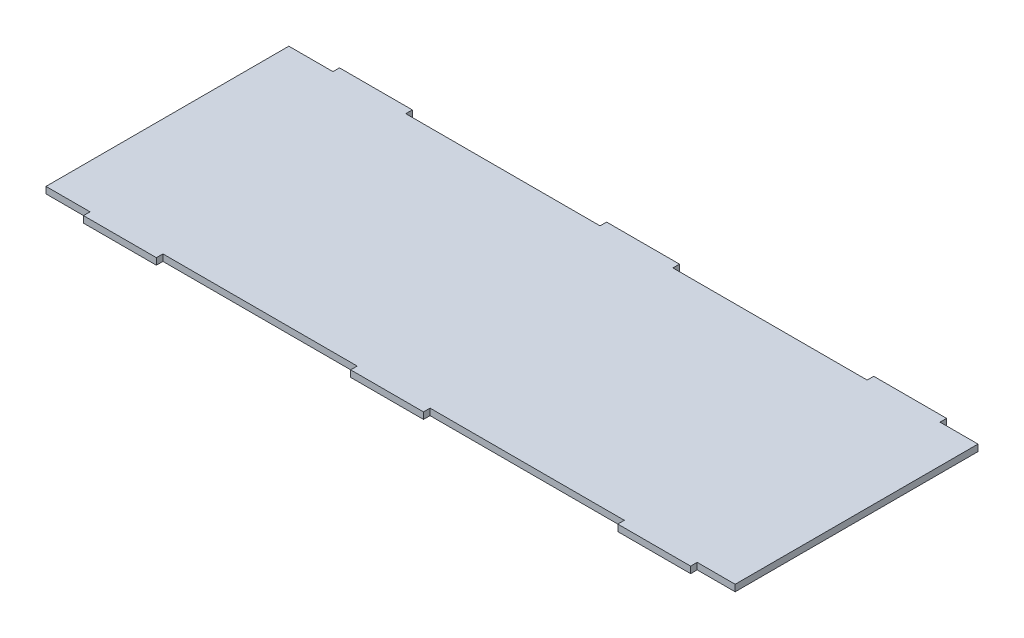
ISO-10303-21;
HEADER;
FILE_DESCRIPTION(('STEP AP214'),'2;1');
FILE_NAME('part.step','',(''),(''),'','','');
FILE_SCHEMA(('AUTOMOTIVE_DESIGN { 1 0 10303 214 1 1 1 1 }'));
ENDSEC;
DATA;
#1=APPLICATION_CONTEXT('core data for automotive mechanical design processes');
#2=APPLICATION_PROTOCOL_DEFINITION('international standard','automotive_design',2000,#1);
#3=PRODUCT_CONTEXT('',#1,'mechanical');
#4=PRODUCT('Part','Part','',(#3));
#5=PRODUCT_RELATED_PRODUCT_CATEGORY('part','',(#4));
#6=PRODUCT_DEFINITION_FORMATION('','',#4);
#7=PRODUCT_DEFINITION_CONTEXT('part definition',#1,'design');
#8=PRODUCT_DEFINITION('design','',#6,#7);
#9=PRODUCT_DEFINITION_SHAPE('','',#8);
#10=(LENGTH_UNIT() NAMED_UNIT(*) SI_UNIT(.MILLI.,.METRE.));
#11=(NAMED_UNIT(*) PLANE_ANGLE_UNIT() SI_UNIT($,.RADIAN.));
#12=(NAMED_UNIT(*) SI_UNIT($,.STERADIAN.) SOLID_ANGLE_UNIT());
#13=UNCERTAINTY_MEASURE_WITH_UNIT(LENGTH_MEASURE(1.E-05),#10,'distance_accuracy_value','');
#14=(GEOMETRIC_REPRESENTATION_CONTEXT(3) GLOBAL_UNCERTAINTY_ASSIGNED_CONTEXT((#13)) GLOBAL_UNIT_ASSIGNED_CONTEXT((#10,
#11,#12)) REPRESENTATION_CONTEXT('',''));
#15=CARTESIAN_POINT('',(0.,0.,0.));
#16=DIRECTION('',(0.,0.,1.));
#17=DIRECTION('',(1.,0.,0.));
#18=AXIS2_PLACEMENT_3D('',#15,#16,#17);
#19=CARTESIAN_POINT('',(0.,0.,0.));
#20=DIRECTION('',(0.,0.,-1.));
#21=DIRECTION('',(-1.,0.,0.));
#22=AXIS2_PLACEMENT_3D('',#19,#20,#21);
#23=PLANE('',#22);
#24=DIRECTION('',(1.,0.,0.));
#25=VECTOR('',#24,1.);
#26=CARTESIAN_POINT('',(-300.,2.7,0.));
#27=LINE('',#26,#25);
#28=CARTESIAN_POINT('',(-130.,2.7,7.68125894545489E-13));
#29=VERTEX_POINT('',#28);
#30=CARTESIAN_POINT('',(-50.,2.7,0.));
#31=VERTEX_POINT('',#30);
#32=EDGE_CURVE('E342',#29,#31,#27,.T.);
#33=ORIENTED_EDGE('',*,*,#32,.T.);
#34=DIRECTION('',(0.,1.,0.));
#35=VECTOR('',#34,1.);
#36=CARTESIAN_POINT('',(-50.,-30.1212549539359,0.));
#37=LINE('',#36,#35);
#38=CARTESIAN_POINT('',(-50.,0.,0.));
#39=VERTEX_POINT('',#38);
#40=EDGE_CURVE('E486',#39,#31,#37,.T.);
#41=ORIENTED_EDGE('',*,*,#40,.F.);
#42=DIRECTION('',(1.,0.,0.));
#43=VECTOR('',#42,1.);
#44=CARTESIAN_POINT('',(-300.,0.,0.));
#45=LINE('',#44,#43);
#46=CARTESIAN_POINT('',(-130.,0.,0.));
#47=VERTEX_POINT('',#46);
#48=EDGE_CURVE('E353',#47,#39,#45,.T.);
#49=ORIENTED_EDGE('',*,*,#48,.F.);
#50=DIRECTION('',(0.,1.,0.));
#51=VECTOR('',#50,1.);
#52=CARTESIAN_POINT('',(-130.,-30.1212549539359,7.68125894545489E-13));
#53=LINE('',#52,#51);
#54=EDGE_CURVE('E374',#47,#29,#53,.T.);
#55=ORIENTED_EDGE('',*,*,#54,.T.);
#56=EDGE_LOOP('',(#33,#41,#49,#55));
#57=FACE_BOUND('',#56,.T.);
#58=ADVANCED_FACE('F38',(#57),#23,.T.);
#59=CARTESIAN_POINT('',(-240.,2.7,0.));
#60=VERTEX_POINT('',#59);
#61=CARTESIAN_POINT('',(-160.,2.7,0.));
#62=VERTEX_POINT('',#61);
#63=EDGE_CURVE('E346',#60,#62,#27,.T.);
#64=ORIENTED_EDGE('',*,*,#63,.T.);
#65=DIRECTION('',(0.,1.,0.));
#66=VECTOR('',#65,1.);
#67=CARTESIAN_POINT('',(-160.,-30.1212549539359,7.68125894545489E-13));
#68=LINE('',#67,#66);
#69=CARTESIAN_POINT('',(-160.,0.,0.));
#70=VERTEX_POINT('',#69);
#71=EDGE_CURVE('E358',#70,#62,#68,.T.);
#72=ORIENTED_EDGE('',*,*,#71,.F.);
#73=CARTESIAN_POINT('',(-240.,0.,0.));
#74=VERTEX_POINT('',#73);
#75=EDGE_CURVE('E416',#74,#70,#45,.T.);
#76=ORIENTED_EDGE('',*,*,#75,.F.);
#77=DIRECTION('',(0.,1.,0.));
#78=VECTOR('',#77,1.);
#79=CARTESIAN_POINT('',(-240.,-30.1212549539359,1.53625178909098E-12));
#80=LINE('',#79,#78);
#81=EDGE_CURVE('E361',#74,#60,#80,.T.);
#82=ORIENTED_EDGE('',*,*,#81,.T.);
#83=EDGE_LOOP('',(#64,#72,#76,#82));
#84=FACE_BOUND('',#83,.T.);
#85=ADVANCED_FACE('F357',(#84),#23,.T.);
#86=DIRECTION('',(0.,1.,0.));
#87=VECTOR('',#86,1.);
#88=CARTESIAN_POINT('',(-4.36142359630139,0.,0.));
#89=LINE('',#88,#87);
#90=CARTESIAN_POINT('',(-4.36142359630139,0.,0.));
#91=VERTEX_POINT('',#90);
#92=CARTESIAN_POINT('',(-4.36142359630143,2.7,0.));
#93=VERTEX_POINT('',#92);
#94=EDGE_CURVE('E53',#91,#93,#89,.T.);
#95=ORIENTED_EDGE('',*,*,#94,.F.);
#96=CARTESIAN_POINT('',(-20.,0.,0.));
#97=VERTEX_POINT('',#96);
#98=EDGE_CURVE('E235',#97,#91,#45,.T.);
#99=ORIENTED_EDGE('',*,*,#98,.F.);
#100=DIRECTION('',(0.,1.,0.));
#101=VECTOR('',#100,1.);
#102=CARTESIAN_POINT('',(-20.,-30.1212549539359,0.));
#103=LINE('',#102,#101);
#104=CARTESIAN_POINT('',(-20.,2.7,0.));
#105=VERTEX_POINT('',#104);
#106=EDGE_CURVE('E484',#97,#105,#103,.T.);
#107=ORIENTED_EDGE('',*,*,#106,.T.);
#108=EDGE_CURVE('E339',#105,#93,#27,.T.);
#109=ORIENTED_EDGE('',*,*,#108,.T.);
#110=EDGE_LOOP('',(#95,#99,#107,#109));
#111=FACE_BOUND('',#110,.T.);
#112=ADVANCED_FACE('F461',(#111),#23,.T.);
#113=CARTESIAN_POINT('',(0.,0.,100.));
#114=DIRECTION('',(0.,0.,-1.));
#115=DIRECTION('',(1.,0.,0.));
#116=AXIS2_PLACEMENT_3D('',#113,#114,#115);
#117=PLANE('',#116);
#118=DIRECTION('',(0.,1.,0.));
#119=VECTOR('',#118,1.);
#120=CARTESIAN_POINT('',(-240.,-30.1212549539359,99.9999999999984));
#121=LINE('',#120,#119);
#122=CARTESIAN_POINT('',(-240.,0.,99.9999999999984));
#123=VERTEX_POINT('',#122);
#124=CARTESIAN_POINT('',(-240.,2.7,99.9999999999984));
#125=VERTEX_POINT('',#124);
#126=EDGE_CURVE('E267',#123,#125,#121,.T.);
#127=ORIENTED_EDGE('',*,*,#126,.F.);
#128=DIRECTION('',(-1.,0.,0.));
#129=VECTOR('',#128,1.);
#130=CARTESIAN_POINT('',(-300.,0.,100.));
#131=LINE('',#130,#129);
#132=CARTESIAN_POINT('',(-160.,0.,100.000000000001));
#133=VERTEX_POINT('',#132);
#134=EDGE_CURVE('E245',#133,#123,#131,.T.);
#135=ORIENTED_EDGE('',*,*,#134,.F.);
#136=DIRECTION('',(0.,1.,0.));
#137=VECTOR('',#136,1.);
#138=CARTESIAN_POINT('',(-160.,-30.1212549539359,100.000000000001));
#139=LINE('',#138,#137);
#140=CARTESIAN_POINT('',(-160.,2.7,100.));
#141=VERTEX_POINT('',#140);
#142=EDGE_CURVE('E265',#133,#141,#139,.T.);
#143=ORIENTED_EDGE('',*,*,#142,.T.);
#144=DIRECTION('',(-1.,0.,0.));
#145=VECTOR('',#144,1.);
#146=CARTESIAN_POINT('',(-300.,2.7,100.));
#147=LINE('',#146,#145);
#148=EDGE_CURVE('E247',#141,#125,#147,.T.);
#149=ORIENTED_EDGE('',*,*,#148,.T.);
#150=EDGE_LOOP('',(#127,#135,#143,#149));
#151=FACE_BOUND('',#150,.T.);
#152=ADVANCED_FACE('F263',(#151),#117,.F.);
#153=CARTESIAN_POINT('',(-4.36142359630138,0.,100.));
#154=VERTEX_POINT('',#153);
#155=CARTESIAN_POINT('',(-20.,0.,100.));
#156=VERTEX_POINT('',#155);
#157=EDGE_CURVE('E232',#154,#156,#131,.T.);
#158=ORIENTED_EDGE('',*,*,#157,.F.);
#159=DIRECTION('',(0.,1.,0.));
#160=VECTOR('',#159,1.);
#161=CARTESIAN_POINT('',(-4.36142359630138,0.,100.));
#162=LINE('',#161,#160);
#163=CARTESIAN_POINT('',(-4.36142359630138,2.7,100.));
#164=VERTEX_POINT('',#163);
#165=EDGE_CURVE('E220',#154,#164,#162,.T.);
#166=ORIENTED_EDGE('',*,*,#165,.T.);
#167=CARTESIAN_POINT('',(-20.,2.7,100.));
#168=VERTEX_POINT('',#167);
#169=EDGE_CURVE('E46',#164,#168,#147,.T.);
#170=ORIENTED_EDGE('',*,*,#169,.T.);
#171=DIRECTION('',(0.,1.,0.));
#172=VECTOR('',#171,1.);
#173=CARTESIAN_POINT('',(-20.,-30.1212549539359,99.9999999999999));
#174=LINE('',#173,#172);
#175=EDGE_CURVE('E239',#156,#168,#174,.T.);
#176=ORIENTED_EDGE('',*,*,#175,.F.);
#177=EDGE_LOOP('',(#158,#166,#170,#176));
#178=FACE_BOUND('',#177,.T.);
#179=ADVANCED_FACE('F237',(#178),#117,.F.);
#180=CARTESIAN_POINT('',(-50.,0.,100.));
#181=VERTEX_POINT('',#180);
#182=CARTESIAN_POINT('',(-130.,0.,99.9999999999992));
#183=VERTEX_POINT('',#182);
#184=EDGE_CURVE('E242',#181,#183,#131,.T.);
#185=ORIENTED_EDGE('',*,*,#184,.F.);
#186=DIRECTION('',(0.,1.,0.));
#187=VECTOR('',#186,1.);
#188=CARTESIAN_POINT('',(-50.,-30.1212549539359,100.000000000001));
#189=LINE('',#188,#187);
#190=CARTESIAN_POINT('',(-50.,2.7,100.000000000001));
#191=VERTEX_POINT('',#190);
#192=EDGE_CURVE('E304',#181,#191,#189,.T.);
#193=ORIENTED_EDGE('',*,*,#192,.T.);
#194=CARTESIAN_POINT('',(-130.,2.7,99.9999999999992));
#195=VERTEX_POINT('',#194);
#196=EDGE_CURVE('E248',#191,#195,#147,.T.);
#197=ORIENTED_EDGE('',*,*,#196,.T.);
#198=DIRECTION('',(0.,1.,0.));
#199=VECTOR('',#198,1.);
#200=CARTESIAN_POINT('',(-130.,-30.1212549539359,99.9999999999992));
#201=LINE('',#200,#199);
#202=EDGE_CURVE('E334',#183,#195,#201,.T.);
#203=ORIENTED_EDGE('',*,*,#202,.F.);
#204=EDGE_LOOP('',(#185,#193,#197,#203));
#205=FACE_BOUND('',#204,.T.);
#206=ADVANCED_FACE('F431',(#205),#117,.F.);
#207=CARTESIAN_POINT('',(-300.,0.,400.012149753972));
#208=DIRECTION('',(0.,1.,0.));
#209=DIRECTION('',(0.,0.,1.));
#210=AXIS2_PLACEMENT_3D('',#207,#208,#209);
#211=PLANE('',#210);
#212=ORIENTED_EDGE('',*,*,#98,.T.);
#213=DIRECTION('',(0.,0.,1.));
#214=VECTOR('',#213,1.);
#215=CARTESIAN_POINT('',(-4.36142359630139,0.,0.));
#216=LINE('',#215,#214);
#217=EDGE_CURVE('E223',#91,#154,#216,.T.);
#218=ORIENTED_EDGE('',*,*,#217,.T.);
#219=ORIENTED_EDGE('',*,*,#157,.T.);
#220=DIRECTION('',(0.,0.,-1.));
#221=VECTOR('',#220,1.);
#222=CARTESIAN_POINT('',(-20.,0.,99.9999999999999));
#223=LINE('',#222,#221);
#224=CARTESIAN_POINT('',(-20.,0.,102.700000000001));
#225=VERTEX_POINT('',#224);
#226=EDGE_CURVE('E297',#225,#156,#223,.T.);
#227=ORIENTED_EDGE('',*,*,#226,.F.);
#228=DIRECTION('',(-1.,0.,0.));
#229=VECTOR('',#228,1.);
#230=CARTESIAN_POINT('',(-50.,0.,102.700000000001));
#231=LINE('',#230,#229);
#232=CARTESIAN_POINT('',(-50.,0.,102.700000000001));
#233=VERTEX_POINT('',#232);
#234=EDGE_CURVE('E300',#225,#233,#231,.T.);
#235=ORIENTED_EDGE('',*,*,#234,.T.);
#236=DIRECTION('',(0.,0.,-1.));
#237=VECTOR('',#236,1.);
#238=CARTESIAN_POINT('',(-50.,0.,100.000000000001));
#239=LINE('',#238,#237);
#240=EDGE_CURVE('E293',#233,#181,#239,.T.);
#241=ORIENTED_EDGE('',*,*,#240,.T.);
#242=ORIENTED_EDGE('',*,*,#184,.T.);
#243=DIRECTION('',(0.,0.,-1.));
#244=VECTOR('',#243,1.);
#245=CARTESIAN_POINT('',(-130.,0.,99.9999999999992));
#246=LINE('',#245,#244);
#247=CARTESIAN_POINT('',(-130.,0.,102.700000000001));
#248=VERTEX_POINT('',#247);
#249=EDGE_CURVE('E319',#248,#183,#246,.T.);
#250=ORIENTED_EDGE('',*,*,#249,.F.);
#251=DIRECTION('',(-1.,0.,0.));
#252=VECTOR('',#251,1.);
#253=CARTESIAN_POINT('',(-160.,0.,102.700000000001));
#254=LINE('',#253,#252);
#255=CARTESIAN_POINT('',(-160.,0.,102.700000000001));
#256=VERTEX_POINT('',#255);
#257=EDGE_CURVE('E323',#248,#256,#254,.T.);
#258=ORIENTED_EDGE('',*,*,#257,.T.);
#259=DIRECTION('',(0.,0.,-1.));
#260=VECTOR('',#259,1.);
#261=CARTESIAN_POINT('',(-160.,0.,100.000000000001));
#262=LINE('',#261,#260);
#263=EDGE_CURVE('E258',#256,#133,#262,.T.);
#264=ORIENTED_EDGE('',*,*,#263,.T.);
#265=ORIENTED_EDGE('',*,*,#134,.T.);
#266=DIRECTION('',(0.,0.,-1.));
#267=VECTOR('',#266,1.);
#268=CARTESIAN_POINT('',(-240.,0.,99.9999999999984));
#269=LINE('',#268,#267);
#270=CARTESIAN_POINT('',(-240.,0.,102.7));
#271=VERTEX_POINT('',#270);
#272=EDGE_CURVE('E255',#271,#123,#269,.T.);
#273=ORIENTED_EDGE('',*,*,#272,.F.);
#274=DIRECTION('',(-1.,0.,0.));
#275=VECTOR('',#274,1.);
#276=CARTESIAN_POINT('',(-270.,0.,102.7));
#277=LINE('',#276,#275);
#278=CARTESIAN_POINT('',(-270.,0.,102.7));
#279=VERTEX_POINT('',#278);
#280=EDGE_CURVE('E272',#271,#279,#277,.T.);
#281=ORIENTED_EDGE('',*,*,#280,.T.);
#282=DIRECTION('',(0.,0.,-1.));
#283=VECTOR('',#282,1.);
#284=CARTESIAN_POINT('',(-270.,0.,100.));
#285=LINE('',#284,#283);
#286=CARTESIAN_POINT('',(-270.,0.,100.));
#287=VERTEX_POINT('',#286);
#288=EDGE_CURVE('E278',#279,#287,#285,.T.);
#289=ORIENTED_EDGE('',*,*,#288,.T.);
#290=CARTESIAN_POINT('',(-288.150181397969,0.,100.));
#291=VERTEX_POINT('',#290);
#292=EDGE_CURVE('E244',#287,#291,#131,.T.);
#293=ORIENTED_EDGE('',*,*,#292,.T.);
#294=DIRECTION('',(0.,0.,-1.));
#295=VECTOR('',#294,1.);
#296=CARTESIAN_POINT('',(-288.150181397969,0.,102.700000000001));
#297=LINE('',#296,#295);
#298=CARTESIAN_POINT('',(-288.150181397969,0.,0.));
#299=VERTEX_POINT('',#298);
#300=EDGE_CURVE('E61',#291,#299,#297,.T.);
#301=ORIENTED_EDGE('',*,*,#300,.T.);
#302=CARTESIAN_POINT('',(-270.,0.,0.));
#303=VERTEX_POINT('',#302);
#304=EDGE_CURVE('E252',#299,#303,#45,.T.);
#305=ORIENTED_EDGE('',*,*,#304,.T.);
#306=DIRECTION('',(0.,0.,1.));
#307=VECTOR('',#306,1.);
#308=CARTESIAN_POINT('',(-270.,0.,1.53625178909098E-12));
#309=LINE('',#308,#307);
#310=CARTESIAN_POINT('',(-270.,0.,-2.7));
#311=VERTEX_POINT('',#310);
#312=EDGE_CURVE('E380',#311,#303,#309,.T.);
#313=ORIENTED_EDGE('',*,*,#312,.F.);
#314=DIRECTION('',(-1.,0.,0.));
#315=VECTOR('',#314,1.);
#316=CARTESIAN_POINT('',(-270.,0.,-2.7));
#317=LINE('',#316,#315);
#318=CARTESIAN_POINT('',(-240.,0.,-2.7));
#319=VERTEX_POINT('',#318);
#320=EDGE_CURVE('E383',#319,#311,#317,.T.);
#321=ORIENTED_EDGE('',*,*,#320,.F.);
#322=DIRECTION('',(0.,0.,1.));
#323=VECTOR('',#322,1.);
#324=CARTESIAN_POINT('',(-240.,0.,1.53625178909098E-12));
#325=LINE('',#324,#323);
#326=EDGE_CURVE('E400',#319,#74,#325,.T.);
#327=ORIENTED_EDGE('',*,*,#326,.T.);
#328=ORIENTED_EDGE('',*,*,#75,.T.);
#329=DIRECTION('',(0.,0.,1.));
#330=VECTOR('',#329,1.);
#331=CARTESIAN_POINT('',(-160.,0.,7.68125894545489E-13));
#332=LINE('',#331,#330);
#333=CARTESIAN_POINT('',(-160.,0.,-2.70000000000077));
#334=VERTEX_POINT('',#333);
#335=EDGE_CURVE('E372',#334,#70,#332,.T.);
#336=ORIENTED_EDGE('',*,*,#335,.F.);
#337=DIRECTION('',(-1.,0.,0.));
#338=VECTOR('',#337,1.);
#339=CARTESIAN_POINT('',(-160.,0.,-2.70000000000077));
#340=LINE('',#339,#338);
#341=CARTESIAN_POINT('',(-130.,0.,-2.70000000000077));
#342=VERTEX_POINT('',#341);
#343=EDGE_CURVE('E389',#342,#334,#340,.T.);
#344=ORIENTED_EDGE('',*,*,#343,.F.);
#345=DIRECTION('',(0.,0.,1.));
#346=VECTOR('',#345,1.);
#347=CARTESIAN_POINT('',(-130.,0.,7.68125894545489E-13));
#348=LINE('',#347,#346);
#349=EDGE_CURVE('E393',#342,#47,#348,.T.);
#350=ORIENTED_EDGE('',*,*,#349,.T.);
#351=ORIENTED_EDGE('',*,*,#48,.T.);
#352=DIRECTION('',(0.,0.,1.));
#353=VECTOR('',#352,1.);
#354=CARTESIAN_POINT('',(-50.,0.,0.));
#355=LINE('',#354,#353);
#356=CARTESIAN_POINT('',(-50.,0.,-2.70000000000154));
#357=VERTEX_POINT('',#356);
#358=EDGE_CURVE('E478',#357,#39,#355,.T.);
#359=ORIENTED_EDGE('',*,*,#358,.F.);
#360=DIRECTION('',(-1.,0.,0.));
#361=VECTOR('',#360,1.);
#362=CARTESIAN_POINT('',(-50.,0.,-2.70000000000154));
#363=LINE('',#362,#361);
#364=CARTESIAN_POINT('',(-20.,0.,-2.70000000000154));
#365=VERTEX_POINT('',#364);
#366=EDGE_CURVE('E476',#365,#357,#363,.T.);
#367=ORIENTED_EDGE('',*,*,#366,.F.);
#368=DIRECTION('',(0.,0.,1.));
#369=VECTOR('',#368,1.);
#370=CARTESIAN_POINT('',(-20.,0.,0.));
#371=LINE('',#370,#369);
#372=EDGE_CURVE('E482',#365,#97,#371,.T.);
#373=ORIENTED_EDGE('',*,*,#372,.T.);
#374=EDGE_LOOP('',(#212,#218,#219,#227,#235,#241,#242,#250,#258,#264,#265,#273,#281,#289,#293,
#301,#305,#313,#321,#327,#328,#336,#344,#350,#351,#359,#367,#373));
#375=FACE_BOUND('',#374,.T.);
#376=ADVANCED_FACE('F231',(#375),#211,.F.);
#377=CARTESIAN_POINT('',(-300.,2.7,400.012149753972));
#378=DIRECTION('',(0.,1.,0.));
#379=DIRECTION('',(-1.,0.,0.));
#380=AXIS2_PLACEMENT_3D('',#377,#378,#379);
#381=PLANE('',#380);
#382=DIRECTION('',(0.,0.,1.));
#383=VECTOR('',#382,1.);
#384=CARTESIAN_POINT('',(-4.36142359630139,2.7,0.));
#385=LINE('',#384,#383);
#386=EDGE_CURVE('E224',#93,#164,#385,.T.);
#387=ORIENTED_EDGE('',*,*,#386,.F.);
#388=ORIENTED_EDGE('',*,*,#108,.F.);
#389=DIRECTION('',(0.,0.,-1.));
#390=VECTOR('',#389,1.);
#391=CARTESIAN_POINT('',(-20.,2.7,0.));
#392=LINE('',#391,#390);
#393=CARTESIAN_POINT('',(-20.,2.7,-2.70000000000154));
#394=VERTEX_POINT('',#393);
#395=EDGE_CURVE('E494',#105,#394,#392,.T.);
#396=ORIENTED_EDGE('',*,*,#395,.T.);
#397=DIRECTION('',(1.,0.,0.));
#398=VECTOR('',#397,1.);
#399=CARTESIAN_POINT('',(-50.,2.7,-2.70000000000154));
#400=LINE('',#399,#398);
#401=CARTESIAN_POINT('',(-50.,2.7,-2.70000000000154));
#402=VERTEX_POINT('',#401);
#403=EDGE_CURVE('E390',#402,#394,#400,.T.);
#404=ORIENTED_EDGE('',*,*,#403,.F.);
#405=DIRECTION('',(0.,0.,-1.));
#406=VECTOR('',#405,1.);
#407=CARTESIAN_POINT('',(-50.,2.7,0.));
#408=LINE('',#407,#406);
#409=EDGE_CURVE('E491',#31,#402,#408,.T.);
#410=ORIENTED_EDGE('',*,*,#409,.F.);
#411=ORIENTED_EDGE('',*,*,#32,.F.);
#412=DIRECTION('',(0.,0.,-1.));
#413=VECTOR('',#412,1.);
#414=CARTESIAN_POINT('',(-130.,2.7,7.68125894545489E-13));
#415=LINE('',#414,#413);
#416=CARTESIAN_POINT('',(-130.,2.7,-2.70000000000077));
#417=VERTEX_POINT('',#416);
#418=EDGE_CURVE('E373',#29,#417,#415,.T.);
#419=ORIENTED_EDGE('',*,*,#418,.T.);
#420=DIRECTION('',(1.,0.,0.));
#421=VECTOR('',#420,1.);
#422=CARTESIAN_POINT('',(-160.,2.7,-2.70000000000077));
#423=LINE('',#422,#421);
#424=CARTESIAN_POINT('',(-160.,2.7,-2.70000000000077));
#425=VERTEX_POINT('',#424);
#426=EDGE_CURVE('E379',#425,#417,#423,.T.);
#427=ORIENTED_EDGE('',*,*,#426,.F.);
#428=DIRECTION('',(0.,0.,-1.));
#429=VECTOR('',#428,1.);
#430=CARTESIAN_POINT('',(-160.,2.7,7.68125894545489E-13));
#431=LINE('',#430,#429);
#432=EDGE_CURVE('E371',#62,#425,#431,.T.);
#433=ORIENTED_EDGE('',*,*,#432,.F.);
#434=ORIENTED_EDGE('',*,*,#63,.F.);
#435=DIRECTION('',(0.,0.,-1.));
#436=VECTOR('',#435,1.);
#437=CARTESIAN_POINT('',(-240.,2.7,1.53625178909098E-12));
#438=LINE('',#437,#436);
#439=CARTESIAN_POINT('',(-240.,2.7,-2.7));
#440=VERTEX_POINT('',#439);
#441=EDGE_CURVE('E405',#60,#440,#438,.T.);
#442=ORIENTED_EDGE('',*,*,#441,.T.);
#443=DIRECTION('',(1.,0.,0.));
#444=VECTOR('',#443,1.);
#445=CARTESIAN_POINT('',(-270.,2.7,-2.7));
#446=LINE('',#445,#444);
#447=CARTESIAN_POINT('',(-270.,2.7,-2.7));
#448=VERTEX_POINT('',#447);
#449=EDGE_CURVE('E407',#448,#440,#446,.T.);
#450=ORIENTED_EDGE('',*,*,#449,.F.);
#451=DIRECTION('',(0.,0.,-1.));
#452=VECTOR('',#451,1.);
#453=CARTESIAN_POINT('',(-270.,2.7,1.53625178909098E-12));
#454=LINE('',#453,#452);
#455=CARTESIAN_POINT('',(-270.,2.7,1.53625178909098E-12));
#456=VERTEX_POINT('',#455);
#457=EDGE_CURVE('E410',#456,#448,#454,.T.);
#458=ORIENTED_EDGE('',*,*,#457,.F.);
#459=CARTESIAN_POINT('',(-288.150181397969,2.7,0.));
#460=VERTEX_POINT('',#459);
#461=EDGE_CURVE('E343',#460,#456,#27,.T.);
#462=ORIENTED_EDGE('',*,*,#461,.F.);
#463=DIRECTION('',(0.,0.,-1.));
#464=VECTOR('',#463,1.);
#465=CARTESIAN_POINT('',(-288.150181397969,2.7,102.700000000001));
#466=LINE('',#465,#464);
#467=CARTESIAN_POINT('',(-288.150181397969,2.7,100.));
#468=VERTEX_POINT('',#467);
#469=EDGE_CURVE('E471',#468,#460,#466,.T.);
#470=ORIENTED_EDGE('',*,*,#469,.F.);
#471=CARTESIAN_POINT('',(-270.,2.7,100.));
#472=VERTEX_POINT('',#471);
#473=EDGE_CURVE('E241',#472,#468,#147,.T.);
#474=ORIENTED_EDGE('',*,*,#473,.F.);
#475=DIRECTION('',(0.,0.,1.));
#476=VECTOR('',#475,1.);
#477=CARTESIAN_POINT('',(-270.,2.7,100.));
#478=LINE('',#477,#476);
#479=CARTESIAN_POINT('',(-270.,2.7,102.7));
#480=VERTEX_POINT('',#479);
#481=EDGE_CURVE('E285',#472,#480,#478,.T.);
#482=ORIENTED_EDGE('',*,*,#481,.T.);
#483=DIRECTION('',(1.,0.,0.));
#484=VECTOR('',#483,1.);
#485=CARTESIAN_POINT('',(-270.,2.7,102.7));
#486=LINE('',#485,#484);
#487=CARTESIAN_POINT('',(-240.,2.7,102.7));
#488=VERTEX_POINT('',#487);
#489=EDGE_CURVE('E288',#480,#488,#486,.T.);
#490=ORIENTED_EDGE('',*,*,#489,.T.);
#491=DIRECTION('',(0.,0.,1.));
#492=VECTOR('',#491,1.);
#493=CARTESIAN_POINT('',(-240.,2.7,99.9999999999984));
#494=LINE('',#493,#492);
#495=EDGE_CURVE('E291',#125,#488,#494,.T.);
#496=ORIENTED_EDGE('',*,*,#495,.F.);
#497=ORIENTED_EDGE('',*,*,#148,.F.);
#498=DIRECTION('',(0.,0.,1.));
#499=VECTOR('',#498,1.);
#500=CARTESIAN_POINT('',(-160.,2.7,100.000000000001));
#501=LINE('',#500,#499);
#502=CARTESIAN_POINT('',(-160.,2.7,102.700000000001));
#503=VERTEX_POINT('',#502);
#504=EDGE_CURVE('E316',#141,#503,#501,.T.);
#505=ORIENTED_EDGE('',*,*,#504,.T.);
#506=DIRECTION('',(1.,0.,0.));
#507=VECTOR('',#506,1.);
#508=CARTESIAN_POINT('',(-160.,2.7,102.700000000001));
#509=LINE('',#508,#507);
#510=CARTESIAN_POINT('',(-130.,2.7,102.700000000001));
#511=VERTEX_POINT('',#510);
#512=EDGE_CURVE('E326',#503,#511,#509,.T.);
#513=ORIENTED_EDGE('',*,*,#512,.T.);
#514=DIRECTION('',(0.,0.,1.));
#515=VECTOR('',#514,1.);
#516=CARTESIAN_POINT('',(-130.,2.7,99.9999999999992));
#517=LINE('',#516,#515);
#518=EDGE_CURVE('E329',#195,#511,#517,.T.);
#519=ORIENTED_EDGE('',*,*,#518,.F.);
#520=ORIENTED_EDGE('',*,*,#196,.F.);
#521=DIRECTION('',(0.,0.,1.));
#522=VECTOR('',#521,1.);
#523=CARTESIAN_POINT('',(-50.,2.7,100.000000000001));
#524=LINE('',#523,#522);
#525=CARTESIAN_POINT('',(-50.,2.7,102.700000000001));
#526=VERTEX_POINT('',#525);
#527=EDGE_CURVE('E307',#191,#526,#524,.T.);
#528=ORIENTED_EDGE('',*,*,#527,.T.);
#529=DIRECTION('',(1.,0.,0.));
#530=VECTOR('',#529,1.);
#531=CARTESIAN_POINT('',(-50.,2.7,102.700000000001));
#532=LINE('',#531,#530);
#533=CARTESIAN_POINT('',(-20.,2.7,102.700000000001));
#534=VERTEX_POINT('',#533);
#535=EDGE_CURVE('E310',#526,#534,#532,.T.);
#536=ORIENTED_EDGE('',*,*,#535,.T.);
#537=DIRECTION('',(0.,0.,1.));
#538=VECTOR('',#537,1.);
#539=CARTESIAN_POINT('',(-20.,2.7,99.9999999999999));
#540=LINE('',#539,#538);
#541=EDGE_CURVE('E313',#168,#534,#540,.T.);
#542=ORIENTED_EDGE('',*,*,#541,.F.);
#543=ORIENTED_EDGE('',*,*,#169,.F.);
#544=EDGE_LOOP('',(#387,#388,#396,#404,#410,#411,#419,#427,#433,#434,#442,#450,#458,#462,#470,
#474,#482,#490,#496,#497,#505,#513,#519,#520,#528,#536,#542,#543));
#545=FACE_BOUND('',#544,.T.);
#546=ADVANCED_FACE('F40',(#545),#381,.T.);
#547=DIRECTION('',(0.,-1.,0.));
#548=VECTOR('',#547,1.);
#549=CARTESIAN_POINT('',(-288.150181397969,2.7,0.));
#550=LINE('',#549,#548);
#551=EDGE_CURVE('E428',#460,#299,#550,.T.);
#552=ORIENTED_EDGE('',*,*,#551,.F.);
#553=ORIENTED_EDGE('',*,*,#461,.T.);
#554=DIRECTION('',(0.,1.,0.));
#555=VECTOR('',#554,1.);
#556=CARTESIAN_POINT('',(-270.,-30.1212549539359,1.53625178909098E-12));
#557=LINE('',#556,#555);
#558=EDGE_CURVE('E403',#303,#456,#557,.T.);
#559=ORIENTED_EDGE('',*,*,#558,.F.);
#560=ORIENTED_EDGE('',*,*,#304,.F.);
#561=EDGE_LOOP('',(#552,#553,#559,#560));
#562=FACE_BOUND('',#561,.T.);
#563=ADVANCED_FACE('F427',(#562),#23,.T.);
#564=ORIENTED_EDGE('',*,*,#473,.T.);
#565=DIRECTION('',(0.,-1.,0.));
#566=VECTOR('',#565,1.);
#567=CARTESIAN_POINT('',(-288.150181397969,0.,100.));
#568=LINE('',#567,#566);
#569=EDGE_CURVE('E11',#468,#291,#568,.T.);
#570=ORIENTED_EDGE('',*,*,#569,.T.);
#571=ORIENTED_EDGE('',*,*,#292,.F.);
#572=DIRECTION('',(0.,1.,0.));
#573=VECTOR('',#572,1.);
#574=CARTESIAN_POINT('',(-270.,-30.1212549539359,100.));
#575=LINE('',#574,#573);
#576=EDGE_CURVE('E282',#287,#472,#575,.T.);
#577=ORIENTED_EDGE('',*,*,#576,.T.);
#578=EDGE_LOOP('',(#564,#570,#571,#577));
#579=FACE_BOUND('',#578,.T.);
#580=ADVANCED_FACE('F445',(#579),#117,.F.);
#581=CARTESIAN_POINT('',(-160.,-30.1212549539359,100.000000000001));
#582=DIRECTION('',(-1.,0.,0.));
#583=DIRECTION('',(0.,-1.,0.));
#584=AXIS2_PLACEMENT_3D('',#581,#582,#583);
#585=PLANE('',#584);
#586=ORIENTED_EDGE('',*,*,#263,.F.);
#587=DIRECTION('',(0.,1.,0.));
#588=VECTOR('',#587,1.);
#589=CARTESIAN_POINT('',(-160.,-30.1212549539359,102.700000000001));
#590=LINE('',#589,#588);
#591=EDGE_CURVE('E332',#256,#503,#590,.T.);
#592=ORIENTED_EDGE('',*,*,#591,.T.);
#593=ORIENTED_EDGE('',*,*,#504,.F.);
#594=ORIENTED_EDGE('',*,*,#142,.F.);
#595=EDGE_LOOP('',(#586,#592,#593,#594));
#596=FACE_BOUND('',#595,.T.);
#597=ADVANCED_FACE('F443',(#596),#585,.T.);
#598=CARTESIAN_POINT('',(-130.,-30.1212549539359,99.9999999999992));
#599=DIRECTION('',(-1.,0.,0.));
#600=DIRECTION('',(0.,-1.,0.));
#601=AXIS2_PLACEMENT_3D('',#598,#599,#600);
#602=PLANE('',#601);
#603=DIRECTION('',(0.,1.,0.));
#604=VECTOR('',#603,1.);
#605=CARTESIAN_POINT('',(-130.,-30.1212549539359,102.700000000001));
#606=LINE('',#605,#604);
#607=EDGE_CURVE('E337',#248,#511,#606,.T.);
#608=ORIENTED_EDGE('',*,*,#607,.F.);
#609=ORIENTED_EDGE('',*,*,#249,.T.);
#610=ORIENTED_EDGE('',*,*,#202,.T.);
#611=ORIENTED_EDGE('',*,*,#518,.T.);
#612=EDGE_LOOP('',(#608,#609,#610,#611));
#613=FACE_BOUND('',#612,.T.);
#614=ADVANCED_FACE('F437',(#613),#602,.F.);
#615=CARTESIAN_POINT('',(-160.,-30.1212549539359,102.700000000001));
#616=DIRECTION('',(0.,0.,1.));
#617=DIRECTION('',(1.,0.,0.));
#618=AXIS2_PLACEMENT_3D('',#615,#616,#617);
#619=PLANE('',#618);
#620=ORIENTED_EDGE('',*,*,#257,.F.);
#621=ORIENTED_EDGE('',*,*,#607,.T.);
#622=ORIENTED_EDGE('',*,*,#512,.F.);
#623=ORIENTED_EDGE('',*,*,#591,.F.);
#624=EDGE_LOOP('',(#620,#621,#622,#623));
#625=FACE_BOUND('',#624,.T.);
#626=ADVANCED_FACE('F441',(#625),#619,.T.);
#627=CARTESIAN_POINT('',(-20.,-30.1212549539359,99.9999999999999));
#628=DIRECTION('',(-1.,0.,0.));
#629=DIRECTION('',(0.,-1.,0.));
#630=AXIS2_PLACEMENT_3D('',#627,#628,#629);
#631=PLANE('',#630);
#632=DIRECTION('',(0.,1.,0.));
#633=VECTOR('',#632,1.);
#634=CARTESIAN_POINT('',(-20.,-30.1212549539359,102.700000000001));
#635=LINE('',#634,#633);
#636=EDGE_CURVE('E299',#225,#534,#635,.T.);
#637=ORIENTED_EDGE('',*,*,#636,.F.);
#638=ORIENTED_EDGE('',*,*,#226,.T.);
#639=ORIENTED_EDGE('',*,*,#175,.T.);
#640=ORIENTED_EDGE('',*,*,#541,.T.);
#641=EDGE_LOOP('',(#637,#638,#639,#640));
#642=FACE_BOUND('',#641,.T.);
#643=ADVANCED_FACE('F532',(#642),#631,.F.);
#644=CARTESIAN_POINT('',(-50.,-30.1212549539359,102.700000000001));
#645=DIRECTION('',(0.,0.,1.));
#646=DIRECTION('',(1.,0.,0.));
#647=AXIS2_PLACEMENT_3D('',#644,#645,#646);
#648=PLANE('',#647);
#649=ORIENTED_EDGE('',*,*,#234,.F.);
#650=ORIENTED_EDGE('',*,*,#636,.T.);
#651=ORIENTED_EDGE('',*,*,#535,.F.);
#652=DIRECTION('',(0.,1.,0.));
#653=VECTOR('',#652,1.);
#654=CARTESIAN_POINT('',(-50.,-30.1212549539359,102.700000000001));
#655=LINE('',#654,#653);
#656=EDGE_CURVE('E302',#233,#526,#655,.T.);
#657=ORIENTED_EDGE('',*,*,#656,.F.);
#658=EDGE_LOOP('',(#649,#650,#651,#657));
#659=FACE_BOUND('',#658,.T.);
#660=ADVANCED_FACE('F536',(#659),#648,.T.);
#661=CARTESIAN_POINT('',(-50.,-30.1212549539359,100.000000000001));
#662=DIRECTION('',(-1.,0.,0.));
#663=DIRECTION('',(0.,-1.,0.));
#664=AXIS2_PLACEMENT_3D('',#661,#662,#663);
#665=PLANE('',#664);
#666=ORIENTED_EDGE('',*,*,#240,.F.);
#667=ORIENTED_EDGE('',*,*,#656,.T.);
#668=ORIENTED_EDGE('',*,*,#527,.F.);
#669=ORIENTED_EDGE('',*,*,#192,.F.);
#670=EDGE_LOOP('',(#666,#667,#668,#669));
#671=FACE_BOUND('',#670,.T.);
#672=ADVANCED_FACE('F539',(#671),#665,.T.);
#673=CARTESIAN_POINT('',(-240.,-30.1212549539359,99.9999999999984));
#674=DIRECTION('',(-1.,0.,0.));
#675=DIRECTION('',(0.,-1.,0.));
#676=AXIS2_PLACEMENT_3D('',#673,#674,#675);
#677=PLANE('',#676);
#678=DIRECTION('',(0.,1.,0.));
#679=VECTOR('',#678,1.);
#680=CARTESIAN_POINT('',(-240.,-30.1212549539359,102.7));
#681=LINE('',#680,#679);
#682=EDGE_CURVE('E271',#271,#488,#681,.T.);
#683=ORIENTED_EDGE('',*,*,#682,.F.);
#684=ORIENTED_EDGE('',*,*,#272,.T.);
#685=ORIENTED_EDGE('',*,*,#126,.T.);
#686=ORIENTED_EDGE('',*,*,#495,.T.);
#687=EDGE_LOOP('',(#683,#684,#685,#686));
#688=FACE_BOUND('',#687,.T.);
#689=ADVANCED_FACE('F541',(#688),#677,.F.);
#690=CARTESIAN_POINT('',(-270.,-30.1212549539359,102.7));
#691=DIRECTION('',(0.,0.,1.));
#692=DIRECTION('',(1.,0.,0.));
#693=AXIS2_PLACEMENT_3D('',#690,#691,#692);
#694=PLANE('',#693);
#695=ORIENTED_EDGE('',*,*,#280,.F.);
#696=ORIENTED_EDGE('',*,*,#682,.T.);
#697=ORIENTED_EDGE('',*,*,#489,.F.);
#698=DIRECTION('',(0.,1.,0.));
#699=VECTOR('',#698,1.);
#700=CARTESIAN_POINT('',(-270.,-30.1212549539359,102.7));
#701=LINE('',#700,#699);
#702=EDGE_CURVE('E274',#279,#480,#701,.T.);
#703=ORIENTED_EDGE('',*,*,#702,.F.);
#704=EDGE_LOOP('',(#695,#696,#697,#703));
#705=FACE_BOUND('',#704,.T.);
#706=ADVANCED_FACE('F547',(#705),#694,.T.);
#707=CARTESIAN_POINT('',(-270.,-30.1212549539359,100.));
#708=DIRECTION('',(-1.,0.,0.));
#709=DIRECTION('',(0.,-1.,0.));
#710=AXIS2_PLACEMENT_3D('',#707,#708,#709);
#711=PLANE('',#710);
#712=ORIENTED_EDGE('',*,*,#288,.F.);
#713=ORIENTED_EDGE('',*,*,#702,.T.);
#714=ORIENTED_EDGE('',*,*,#481,.F.);
#715=ORIENTED_EDGE('',*,*,#576,.F.);
#716=EDGE_LOOP('',(#712,#713,#714,#715));
#717=FACE_BOUND('',#716,.T.);
#718=ADVANCED_FACE('F558',(#717),#711,.T.);
#719=CARTESIAN_POINT('',(-270.,-30.1212549539359,1.53625178909098E-12));
#720=DIRECTION('',(1.,0.,0.));
#721=DIRECTION('',(0.,0.,-1.));
#722=AXIS2_PLACEMENT_3D('',#719,#720,#721);
#723=PLANE('',#722);
#724=DIRECTION('',(0.,1.,0.));
#725=VECTOR('',#724,1.);
#726=CARTESIAN_POINT('',(-270.,-30.1212549539359,-2.7));
#727=LINE('',#726,#725);
#728=EDGE_CURVE('E397',#311,#448,#727,.T.);
#729=ORIENTED_EDGE('',*,*,#728,.F.);
#730=ORIENTED_EDGE('',*,*,#312,.T.);
#731=ORIENTED_EDGE('',*,*,#558,.T.);
#732=ORIENTED_EDGE('',*,*,#457,.T.);
#733=EDGE_LOOP('',(#729,#730,#731,#732));
#734=FACE_BOUND('',#733,.T.);
#735=ADVANCED_FACE('F425',(#734),#723,.F.);
#736=CARTESIAN_POINT('',(-270.,-30.1212549539359,-2.7));
#737=DIRECTION('',(0.,0.,1.));
#738=DIRECTION('',(1.,0.,0.));
#739=AXIS2_PLACEMENT_3D('',#736,#737,#738);
#740=PLANE('',#739);
#741=DIRECTION('',(0.,1.,0.));
#742=VECTOR('',#741,1.);
#743=CARTESIAN_POINT('',(-240.,-30.1212549539359,-2.7));
#744=LINE('',#743,#742);
#745=EDGE_CURVE('E399',#319,#440,#744,.T.);
#746=ORIENTED_EDGE('',*,*,#745,.F.);
#747=ORIENTED_EDGE('',*,*,#320,.T.);
#748=ORIENTED_EDGE('',*,*,#728,.T.);
#749=ORIENTED_EDGE('',*,*,#449,.T.);
#750=EDGE_LOOP('',(#746,#747,#748,#749));
#751=FACE_BOUND('',#750,.T.);
#752=ADVANCED_FACE('F567',(#751),#740,.F.);
#753=CARTESIAN_POINT('',(-240.,-30.1212549539359,1.53625178909098E-12));
#754=DIRECTION('',(1.,0.,0.));
#755=DIRECTION('',(0.,1.,0.));
#756=AXIS2_PLACEMENT_3D('',#753,#754,#755);
#757=PLANE('',#756);
#758=ORIENTED_EDGE('',*,*,#326,.F.);
#759=ORIENTED_EDGE('',*,*,#745,.T.);
#760=ORIENTED_EDGE('',*,*,#441,.F.);
#761=ORIENTED_EDGE('',*,*,#81,.F.);
#762=EDGE_LOOP('',(#758,#759,#760,#761));
#763=FACE_BOUND('',#762,.T.);
#764=ADVANCED_FACE('F419',(#763),#757,.T.);
#765=CARTESIAN_POINT('',(-160.,-30.1212549539359,7.68125894545489E-13));
#766=DIRECTION('',(1.,0.,0.));
#767=DIRECTION('',(0.,1.,0.));
#768=AXIS2_PLACEMENT_3D('',#765,#766,#767);
#769=PLANE('',#768);
#770=DIRECTION('',(0.,1.,0.));
#771=VECTOR('',#770,1.);
#772=CARTESIAN_POINT('',(-160.,-30.1212549539359,-2.70000000000077));
#773=LINE('',#772,#771);
#774=EDGE_CURVE('E396',#334,#425,#773,.T.);
#775=ORIENTED_EDGE('',*,*,#774,.F.);
#776=ORIENTED_EDGE('',*,*,#335,.T.);
#777=ORIENTED_EDGE('',*,*,#71,.T.);
#778=ORIENTED_EDGE('',*,*,#432,.T.);
#779=EDGE_LOOP('',(#775,#776,#777,#778));
#780=FACE_BOUND('',#779,.T.);
#781=ADVANCED_FACE('F370',(#780),#769,.F.);
#782=CARTESIAN_POINT('',(-160.,-30.1212549539359,-2.70000000000077));
#783=DIRECTION('',(0.,0.,1.));
#784=DIRECTION('',(1.,0.,0.));
#785=AXIS2_PLACEMENT_3D('',#782,#783,#784);
#786=PLANE('',#785);
#787=DIRECTION('',(0.,1.,0.));
#788=VECTOR('',#787,1.);
#789=CARTESIAN_POINT('',(-130.,-30.1212549539359,-2.70000000000077));
#790=LINE('',#789,#788);
#791=EDGE_CURVE('E503',#342,#417,#790,.T.);
#792=ORIENTED_EDGE('',*,*,#791,.F.);
#793=ORIENTED_EDGE('',*,*,#343,.T.);
#794=ORIENTED_EDGE('',*,*,#774,.T.);
#795=ORIENTED_EDGE('',*,*,#426,.T.);
#796=EDGE_LOOP('',(#792,#793,#794,#795));
#797=FACE_BOUND('',#796,.T.);
#798=ADVANCED_FACE('F514',(#797),#786,.F.);
#799=CARTESIAN_POINT('',(-130.,-30.1212549539359,7.68125894545489E-13));
#800=DIRECTION('',(1.,0.,0.));
#801=DIRECTION('',(0.,1.,0.));
#802=AXIS2_PLACEMENT_3D('',#799,#800,#801);
#803=PLANE('',#802);
#804=ORIENTED_EDGE('',*,*,#349,.F.);
#805=ORIENTED_EDGE('',*,*,#791,.T.);
#806=ORIENTED_EDGE('',*,*,#418,.F.);
#807=ORIENTED_EDGE('',*,*,#54,.F.);
#808=EDGE_LOOP('',(#804,#805,#806,#807));
#809=FACE_BOUND('',#808,.T.);
#810=ADVANCED_FACE('F511',(#809),#803,.T.);
#811=CARTESIAN_POINT('',(-50.,-30.1212549539359,0.));
#812=DIRECTION('',(1.,0.,0.));
#813=DIRECTION('',(0.,0.,-1.));
#814=AXIS2_PLACEMENT_3D('',#811,#812,#813);
#815=PLANE('',#814);
#816=DIRECTION('',(0.,1.,0.));
#817=VECTOR('',#816,1.);
#818=CARTESIAN_POINT('',(-50.,-30.1212549539359,-2.70000000000154));
#819=LINE('',#818,#817);
#820=EDGE_CURVE('E489',#357,#402,#819,.T.);
#821=ORIENTED_EDGE('',*,*,#820,.F.);
#822=ORIENTED_EDGE('',*,*,#358,.T.);
#823=ORIENTED_EDGE('',*,*,#40,.T.);
#824=ORIENTED_EDGE('',*,*,#409,.T.);
#825=EDGE_LOOP('',(#821,#822,#823,#824));
#826=FACE_BOUND('',#825,.T.);
#827=ADVANCED_FACE('F518',(#826),#815,.F.);
#828=CARTESIAN_POINT('',(-20.,-30.1212549539359,0.));
#829=DIRECTION('',(1.,0.,0.));
#830=DIRECTION('',(0.,1.,0.));
#831=AXIS2_PLACEMENT_3D('',#828,#829,#830);
#832=PLANE('',#831);
#833=ORIENTED_EDGE('',*,*,#372,.F.);
#834=DIRECTION('',(0.,1.,0.));
#835=VECTOR('',#834,1.);
#836=CARTESIAN_POINT('',(-20.,-30.1212549539359,-2.70000000000154));
#837=LINE('',#836,#835);
#838=EDGE_CURVE('E481',#365,#394,#837,.T.);
#839=ORIENTED_EDGE('',*,*,#838,.T.);
#840=ORIENTED_EDGE('',*,*,#395,.F.);
#841=ORIENTED_EDGE('',*,*,#106,.F.);
#842=EDGE_LOOP('',(#833,#839,#840,#841));
#843=FACE_BOUND('',#842,.T.);
#844=ADVANCED_FACE('F527',(#843),#832,.T.);
#845=CARTESIAN_POINT('',(-50.,-30.1212549539359,-2.70000000000154));
#846=DIRECTION('',(0.,0.,1.));
#847=DIRECTION('',(1.,0.,0.));
#848=AXIS2_PLACEMENT_3D('',#845,#846,#847);
#849=PLANE('',#848);
#850=ORIENTED_EDGE('',*,*,#838,.F.);
#851=ORIENTED_EDGE('',*,*,#366,.T.);
#852=ORIENTED_EDGE('',*,*,#820,.T.);
#853=ORIENTED_EDGE('',*,*,#403,.T.);
#854=EDGE_LOOP('',(#850,#851,#852,#853));
#855=FACE_BOUND('',#854,.T.);
#856=ADVANCED_FACE('F522',(#855),#849,.F.);
#857=CARTESIAN_POINT('',(-288.150181397969,2.7,102.700000000001));
#858=DIRECTION('',(1.,0.,0.));
#859=DIRECTION('',(0.,0.,-1.));
#860=AXIS2_PLACEMENT_3D('',#857,#858,#859);
#861=PLANE('',#860);
#862=ORIENTED_EDGE('',*,*,#469,.T.);
#863=ORIENTED_EDGE('',*,*,#551,.T.);
#864=ORIENTED_EDGE('',*,*,#300,.F.);
#865=ORIENTED_EDGE('',*,*,#569,.F.);
#866=EDGE_LOOP('',(#862,#863,#864,#865));
#867=FACE_BOUND('',#866,.T.);
#868=ADVANCED_FACE('F584',(#867),#861,.F.);
#869=CARTESIAN_POINT('',(-4.36142359630139,0.,0.));
#870=DIRECTION('',(-1.,0.,0.));
#871=DIRECTION('',(0.,0.,1.));
#872=AXIS2_PLACEMENT_3D('',#869,#870,#871);
#873=PLANE('',#872);
#874=ORIENTED_EDGE('',*,*,#386,.T.);
#875=ORIENTED_EDGE('',*,*,#165,.F.);
#876=ORIENTED_EDGE('',*,*,#217,.F.);
#877=ORIENTED_EDGE('',*,*,#94,.T.);
#878=EDGE_LOOP('',(#874,#875,#876,#877));
#879=FACE_BOUND('',#878,.T.);
#880=ADVANCED_FACE('F222',(#879),#873,.F.);
#881=CLOSED_SHELL('',(#58,#85,#112,#152,#179,#206,#376,#546,#563,#580,#597,#614,#626,#643,#660,
#672,#689,#706,#718,#735,#752,#764,#781,#798,#810,#827,#844,#856,#868,#880));
#882=MANIFOLD_SOLID_BREP('B2',#881);
#883=ADVANCED_BREP_SHAPE_REPRESENTATION('',(#18,#882),#14);
#884=SHAPE_DEFINITION_REPRESENTATION(#9,#883);
ENDSEC;
END-ISO-10303-21;
